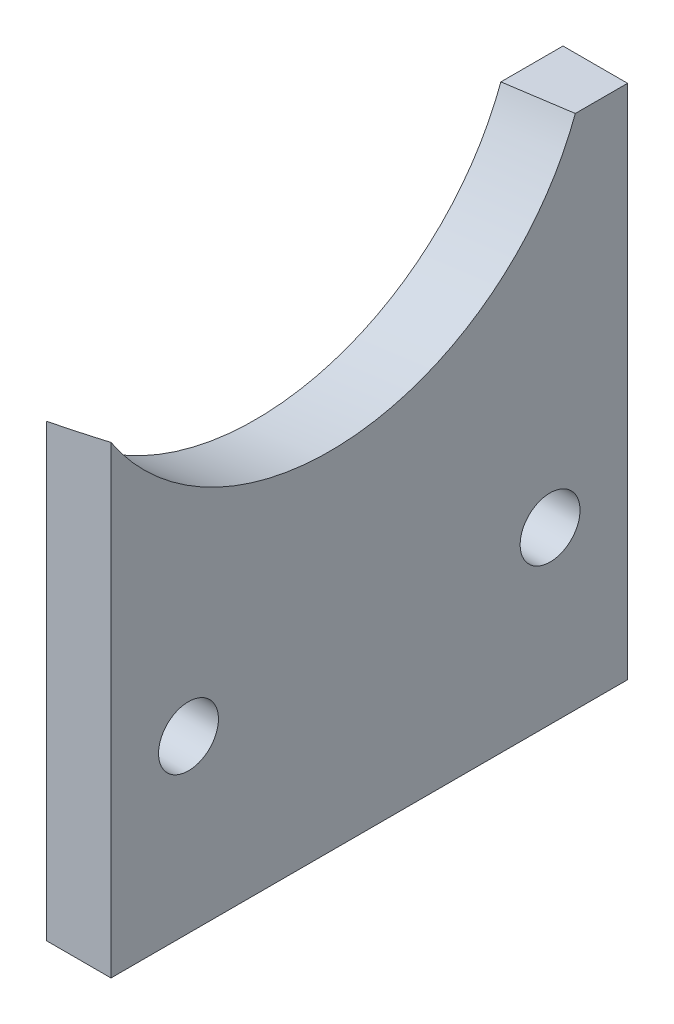
ISO-10303-21;
HEADER;
FILE_DESCRIPTION(('STEP AP214'),'2;1');
FILE_NAME('part.step','',(''),(''),'','','');
FILE_SCHEMA(('AUTOMOTIVE_DESIGN { 1 0 10303 214 1 1 1 1 }'));
ENDSEC;
DATA;
#1=APPLICATION_CONTEXT('core data for automotive mechanical design processes');
#2=APPLICATION_PROTOCOL_DEFINITION('international standard','automotive_design',2000,#1);
#3=PRODUCT_CONTEXT('',#1,'mechanical');
#4=PRODUCT('Part','Part','',(#3));
#5=PRODUCT_RELATED_PRODUCT_CATEGORY('part','',(#4));
#6=PRODUCT_DEFINITION_FORMATION('','',#4);
#7=PRODUCT_DEFINITION_CONTEXT('part definition',#1,'design');
#8=PRODUCT_DEFINITION('design','',#6,#7);
#9=PRODUCT_DEFINITION_SHAPE('','',#8);
#10=(LENGTH_UNIT() NAMED_UNIT(*) SI_UNIT(.MILLI.,.METRE.));
#11=(NAMED_UNIT(*) PLANE_ANGLE_UNIT() SI_UNIT($,.RADIAN.));
#12=(NAMED_UNIT(*) SI_UNIT($,.STERADIAN.) SOLID_ANGLE_UNIT());
#13=UNCERTAINTY_MEASURE_WITH_UNIT(LENGTH_MEASURE(1.E-05),#10,'distance_accuracy_value','');
#14=(GEOMETRIC_REPRESENTATION_CONTEXT(3) GLOBAL_UNCERTAINTY_ASSIGNED_CONTEXT((#13)) GLOBAL_UNIT_ASSIGNED_CONTEXT((#10,
#11,#12)) REPRESENTATION_CONTEXT('',''));
#15=CARTESIAN_POINT('',(0.,0.,0.));
#16=DIRECTION('',(0.,0.,1.));
#17=DIRECTION('',(1.,0.,0.));
#18=AXIS2_PLACEMENT_3D('',#15,#16,#17);
#19=CARTESIAN_POINT('',(3.175,12.7,12.7));
#20=DIRECTION('',(0.,-1.,0.));
#21=DIRECTION('',(0.,0.,-1.));
#22=AXIS2_PLACEMENT_3D('',#19,#20,#21);
#23=PLANE('',#22);
#24=DIRECTION('',(0.988516694324815,0.,-0.151111697234661));
#25=VECTOR('',#24,1.);
#26=CARTESIAN_POINT('',(-127.693699295533,12.7,9.87601979083858));
#27=LINE('',#26,#25);
#28=CARTESIAN_POINT('',(3.17500000000001,12.7000000000003,-10.1295009848605));
#29=VERTEX_POINT('',#28);
#30=CARTESIAN_POINT('',(0.,12.7,-9.64414788817069));
#31=VERTEX_POINT('',#30);
#32=EDGE_CURVE('E84',#29,#31,#27,.F.);
#33=ORIENTED_EDGE('',*,*,#32,.F.);
#34=DIRECTION('',(0.,0.,1.));
#35=VECTOR('',#34,1.);
#36=CARTESIAN_POINT('',(3.175,12.7,12.7));
#37=LINE('',#36,#35);
#38=CARTESIAN_POINT('',(3.175,12.7,-12.7));
#39=VERTEX_POINT('',#38);
#40=EDGE_CURVE('E109',#39,#29,#37,.T.);
#41=ORIENTED_EDGE('',*,*,#40,.F.);
#42=DIRECTION('',(-1.,0.,0.));
#43=VECTOR('',#42,1.);
#44=CARTESIAN_POINT('',(3.175,12.7,-12.7));
#45=LINE('',#44,#43);
#46=CARTESIAN_POINT('',(0.,12.7,-12.7));
#47=VERTEX_POINT('',#46);
#48=EDGE_CURVE('E107',#39,#47,#45,.T.);
#49=ORIENTED_EDGE('',*,*,#48,.T.);
#50=DIRECTION('',(0.,0.,1.));
#51=VECTOR('',#50,1.);
#52=CARTESIAN_POINT('',(0.,12.7,12.7));
#53=LINE('',#52,#51);
#54=EDGE_CURVE('E47',#47,#31,#53,.T.);
#55=ORIENTED_EDGE('',*,*,#54,.T.);
#56=EDGE_LOOP('',(#33,#41,#49,#55));
#57=FACE_BOUND('',#56,.T.);
#58=ADVANCED_FACE('F44',(#57),#23,.F.);
#59=CARTESIAN_POINT('',(3.175,-12.7,12.7));
#60=DIRECTION('',(0.,0.,-1.));
#61=DIRECTION('',(-1.,0.,0.));
#62=AXIS2_PLACEMENT_3D('',#59,#60,#61);
#63=PLANE('',#62);
#64=CARTESIAN_POINT('',(-67.2036911117293,17.0485895897785,12.7));
#65=DIRECTION('',(0.,0.,-1.));
#66=DIRECTION('',(1.,0.,0.));
#67=AXIS2_PLACEMENT_3D('',#64,#65,#66);
#68=ELLIPSE('',#67,84.0437916614633,12.7);
#69=CARTESIAN_POINT('',(0.,9.42227877403633,12.7));
#70=VERTEX_POINT('',#69);
#71=CARTESIAN_POINT('',(3.175,10.106986710105,12.7));
#72=VERTEX_POINT('',#71);
#73=EDGE_CURVE('E11',#70,#72,#68,.F.);
#74=ORIENTED_EDGE('',*,*,#73,.F.);
#75=DIRECTION('',(0.,-1.,0.));
#76=VECTOR('',#75,1.);
#77=CARTESIAN_POINT('',(0.,-12.7,12.7));
#78=LINE('',#77,#76);
#79=CARTESIAN_POINT('',(0.,-12.7,12.7));
#80=VERTEX_POINT('',#79);
#81=EDGE_CURVE('E97',#70,#80,#78,.T.);
#82=ORIENTED_EDGE('',*,*,#81,.T.);
#83=DIRECTION('',(-1.,0.,0.));
#84=VECTOR('',#83,1.);
#85=CARTESIAN_POINT('',(3.175,-12.7,12.7));
#86=LINE('',#85,#84);
#87=CARTESIAN_POINT('',(3.175,-12.7,12.7));
#88=VERTEX_POINT('',#87);
#89=EDGE_CURVE('E105',#88,#80,#86,.T.);
#90=ORIENTED_EDGE('',*,*,#89,.F.);
#91=DIRECTION('',(0.,-1.,0.));
#92=VECTOR('',#91,1.);
#93=CARTESIAN_POINT('',(3.175,-12.7,12.7));
#94=LINE('',#93,#92);
#95=EDGE_CURVE('E99',#72,#88,#94,.T.);
#96=ORIENTED_EDGE('',*,*,#95,.F.);
#97=EDGE_LOOP('',(#74,#82,#90,#96));
#98=FACE_BOUND('',#97,.T.);
#99=ADVANCED_FACE('F95',(#98),#63,.F.);
#100=CARTESIAN_POINT('',(3.175,-12.7,12.7));
#101=DIRECTION('',(0.,1.,0.));
#102=DIRECTION('',(0.,0.,1.));
#103=AXIS2_PLACEMENT_3D('',#100,#101,#102);
#104=PLANE('',#103);
#105=DIRECTION('',(0.,0.,-1.));
#106=VECTOR('',#105,1.);
#107=CARTESIAN_POINT('',(0.,-12.7,12.7));
#108=LINE('',#107,#106);
#109=CARTESIAN_POINT('',(0.,-12.7,-12.7));
#110=VERTEX_POINT('',#109);
#111=EDGE_CURVE('E104',#80,#110,#108,.T.);
#112=ORIENTED_EDGE('',*,*,#111,.T.);
#113=DIRECTION('',(-1.,0.,0.));
#114=VECTOR('',#113,1.);
#115=CARTESIAN_POINT('',(3.175,-12.7,-12.7));
#116=LINE('',#115,#114);
#117=CARTESIAN_POINT('',(3.175,-12.7,-12.7));
#118=VERTEX_POINT('',#117);
#119=EDGE_CURVE('E122',#118,#110,#116,.T.);
#120=ORIENTED_EDGE('',*,*,#119,.F.);
#121=DIRECTION('',(0.,0.,-1.));
#122=VECTOR('',#121,1.);
#123=CARTESIAN_POINT('',(3.175,-12.7,12.7));
#124=LINE('',#123,#122);
#125=EDGE_CURVE('E124',#88,#118,#124,.T.);
#126=ORIENTED_EDGE('',*,*,#125,.F.);
#127=ORIENTED_EDGE('',*,*,#89,.T.);
#128=EDGE_LOOP('',(#112,#120,#126,#127));
#129=FACE_BOUND('',#128,.T.);
#130=ADVANCED_FACE('F163',(#129),#104,.F.);
#131=CARTESIAN_POINT('',(3.175,-12.7,-12.7));
#132=DIRECTION('',(0.,0.,1.));
#133=DIRECTION('',(0.,-1.,0.));
#134=AXIS2_PLACEMENT_3D('',#131,#132,#133);
#135=PLANE('',#134);
#136=DIRECTION('',(0.,1.,0.));
#137=VECTOR('',#136,1.);
#138=CARTESIAN_POINT('',(0.,-12.7,-12.7));
#139=LINE('',#138,#137);
#140=EDGE_CURVE('E128',#110,#47,#139,.T.);
#141=ORIENTED_EDGE('',*,*,#140,.T.);
#142=ORIENTED_EDGE('',*,*,#48,.F.);
#143=DIRECTION('',(0.,1.,0.));
#144=VECTOR('',#143,1.);
#145=CARTESIAN_POINT('',(3.175,-12.7,-12.7));
#146=LINE('',#145,#144);
#147=EDGE_CURVE('E126',#118,#39,#146,.T.);
#148=ORIENTED_EDGE('',*,*,#147,.F.);
#149=ORIENTED_EDGE('',*,*,#119,.T.);
#150=EDGE_LOOP('',(#141,#142,#148,#149));
#151=FACE_BOUND('',#150,.T.);
#152=ADVANCED_FACE('F172',(#151),#135,.F.);
#153=CARTESIAN_POINT('',(3.175,0.,0.));
#154=DIRECTION('',(1.,0.,0.));
#155=DIRECTION('',(0.,0.,-1.));
#156=AXIS2_PLACEMENT_3D('',#153,#154,#155);
#157=PLANE('',#156);
#158=CARTESIAN_POINT('',(3.175,-4.30895018450539,8.88994184738934));
#159=DIRECTION('',(1.,0.,0.));
#160=DIRECTION('',(0.,0.,-1.));
#161=AXIS2_PLACEMENT_3D('',#158,#159,#160);
#162=CIRCLE('',#161,1.47319693101347);
#163=CARTESIAN_POINT('',(3.175,-4.30895018450539,7.41674491637587));
#164=VERTEX_POINT('',#163);
#165=EDGE_CURVE('E116',#164,#164,#162,.T.);
#166=ORIENTED_EDGE('',*,*,#165,.F.);
#167=EDGE_LOOP('',(#166));
#168=FACE_BOUND('',#167,.T.);
#169=CARTESIAN_POINT('',(3.175,-4.30895018450539,-8.88994184738934));
#170=DIRECTION('',(-1.,0.,0.));
#171=DIRECTION('',(0.,0.,1.));
#172=AXIS2_PLACEMENT_3D('',#169,#170,#171);
#173=CIRCLE('',#172,1.47319693101347);
#174=CARTESIAN_POINT('',(3.175,-4.30895018450539,-7.41674491637587));
#175=VERTEX_POINT('',#174);
#176=EDGE_CURVE('E111',#175,#175,#173,.T.);
#177=ORIENTED_EDGE('',*,*,#176,.T.);
#178=EDGE_LOOP('',(#177));
#179=FACE_BOUND('',#178,.T.);
#180=ORIENTED_EDGE('',*,*,#40,.T.);
#181=CARTESIAN_POINT('',(3.17500000000001,17.0485895897787,1.94141238675647));
#182=DIRECTION('',(1.,0.,0.));
#183=DIRECTION('',(0.,0.,-1.));
#184=AXIS2_PLACEMENT_3D('',#181,#182,#183);
#185=ELLIPSE('',#184,12.8475321387207,12.7);
#186=EDGE_CURVE('E61',#29,#72,#185,.F.);
#187=ORIENTED_EDGE('',*,*,#186,.T.);
#188=ORIENTED_EDGE('',*,*,#95,.T.);
#189=ORIENTED_EDGE('',*,*,#125,.T.);
#190=ORIENTED_EDGE('',*,*,#147,.T.);
#191=EDGE_LOOP('',(#180,#187,#188,#189,#190));
#192=FACE_BOUND('',#191,.T.);
#193=ADVANCED_FACE('F144',(#168,#179,#192),#157,.T.);
#194=CARTESIAN_POINT('',(0.,0.,0.));
#195=DIRECTION('',(1.,0.,0.));
#196=DIRECTION('',(0.,0.,-1.));
#197=AXIS2_PLACEMENT_3D('',#194,#195,#196);
#198=PLANE('',#197);
#199=CARTESIAN_POINT('',(0.,17.0485895897787,2.4267654834462));
#200=DIRECTION('',(1.,0.,0.));
#201=DIRECTION('',(0.,0.,-1.));
#202=AXIS2_PLACEMENT_3D('',#199,#200,#201);
#203=ELLIPSE('',#202,12.8475321387207,12.7);
#204=EDGE_CURVE('E53',#31,#70,#203,.F.);
#205=ORIENTED_EDGE('',*,*,#204,.F.);
#206=ORIENTED_EDGE('',*,*,#54,.F.);
#207=ORIENTED_EDGE('',*,*,#140,.F.);
#208=ORIENTED_EDGE('',*,*,#111,.F.);
#209=ORIENTED_EDGE('',*,*,#81,.F.);
#210=EDGE_LOOP('',(#205,#206,#207,#208,#209));
#211=FACE_BOUND('',#210,.T.);
#212=CARTESIAN_POINT('',(0.,-4.30895018450539,8.88994184738934));
#213=DIRECTION('',(1.,0.,0.));
#214=DIRECTION('',(0.,0.,-1.));
#215=AXIS2_PLACEMENT_3D('',#212,#213,#214);
#216=CIRCLE('',#215,1.47319693101347);
#217=CARTESIAN_POINT('',(0.,-4.30895018450539,7.41674491637587));
#218=VERTEX_POINT('',#217);
#219=EDGE_CURVE('E114',#218,#218,#216,.F.);
#220=ORIENTED_EDGE('',*,*,#219,.F.);
#221=EDGE_LOOP('',(#220));
#222=FACE_BOUND('',#221,.T.);
#223=CARTESIAN_POINT('',(0.,-4.30895018450539,-8.88994184738934));
#224=DIRECTION('',(1.,0.,0.));
#225=DIRECTION('',(0.,0.,-1.));
#226=AXIS2_PLACEMENT_3D('',#223,#224,#225);
#227=CIRCLE('',#226,1.47319693101347);
#228=CARTESIAN_POINT('',(0.,-4.30895018450539,-10.3631387784028));
#229=VERTEX_POINT('',#228);
#230=EDGE_CURVE('E119',#229,#229,#227,.T.);
#231=ORIENTED_EDGE('',*,*,#230,.T.);
#232=EDGE_LOOP('',(#231));
#233=FACE_BOUND('',#232,.T.);
#234=ADVANCED_FACE('F101',(#211,#222,#233),#198,.F.);
#235=CARTESIAN_POINT('',(3.175,-4.30895018450539,-8.88994184738934));
#236=DIRECTION('',(-1.,0.,0.));
#237=DIRECTION('',(0.,0.,1.));
#238=AXIS2_PLACEMENT_3D('',#235,#236,#237);
#239=CYLINDRICAL_SURFACE('',#238,1.47319693101347);
#240=ORIENTED_EDGE('',*,*,#176,.F.);
#241=EDGE_LOOP('',(#240));
#242=FACE_BOUND('',#241,.T.);
#243=ORIENTED_EDGE('',*,*,#230,.F.);
#244=EDGE_LOOP('',(#243));
#245=FACE_BOUND('',#244,.T.);
#246=ADVANCED_FACE('F143',(#242,#245),#239,.F.);
#247=CARTESIAN_POINT('',(3.175,-4.30895018450539,8.88994184738934));
#248=DIRECTION('',(-1.,0.,0.));
#249=DIRECTION('',(0.,0.,1.));
#250=AXIS2_PLACEMENT_3D('',#247,#248,#249);
#251=CYLINDRICAL_SURFACE('',#250,1.47319693101347);
#252=ORIENTED_EDGE('',*,*,#165,.T.);
#253=EDGE_LOOP('',(#252));
#254=FACE_BOUND('',#253,.T.);
#255=ORIENTED_EDGE('',*,*,#219,.T.);
#256=EDGE_LOOP('',(#255));
#257=FACE_BOUND('',#256,.T.);
#258=ADVANCED_FACE('F140',(#254,#257),#251,.F.);
#259=CARTESIAN_POINT('',(-125.890589283766,17.0485895897783,21.671296933201));
#260=DIRECTION('',(0.988516694324815,0.,-0.151111697234661));
#261=DIRECTION('',(0.151110033958441,-0.0046918805860167,0.98850581378849));
#262=AXIS2_PLACEMENT_3D('',#259,#260,#261);
#263=CYLINDRICAL_SURFACE('',#262,12.7);
#264=ORIENTED_EDGE('',*,*,#32,.T.);
#265=ORIENTED_EDGE('',*,*,#204,.T.);
#266=ORIENTED_EDGE('',*,*,#73,.T.);
#267=ORIENTED_EDGE('',*,*,#186,.F.);
#268=EDGE_LOOP('',(#264,#265,#266,#267));
#269=FACE_BOUND('',#268,.T.);
#270=ADVANCED_FACE('F87',(#269),#263,.F.);
#271=CLOSED_SHELL('',(#58,#99,#130,#152,#193,#234,#246,#258,#270));
#272=MANIFOLD_SOLID_BREP('B2',#271);
#273=ADVANCED_BREP_SHAPE_REPRESENTATION('',(#18,#272),#14);
#274=SHAPE_DEFINITION_REPRESENTATION(#9,#273);
ENDSEC;
END-ISO-10303-21;
